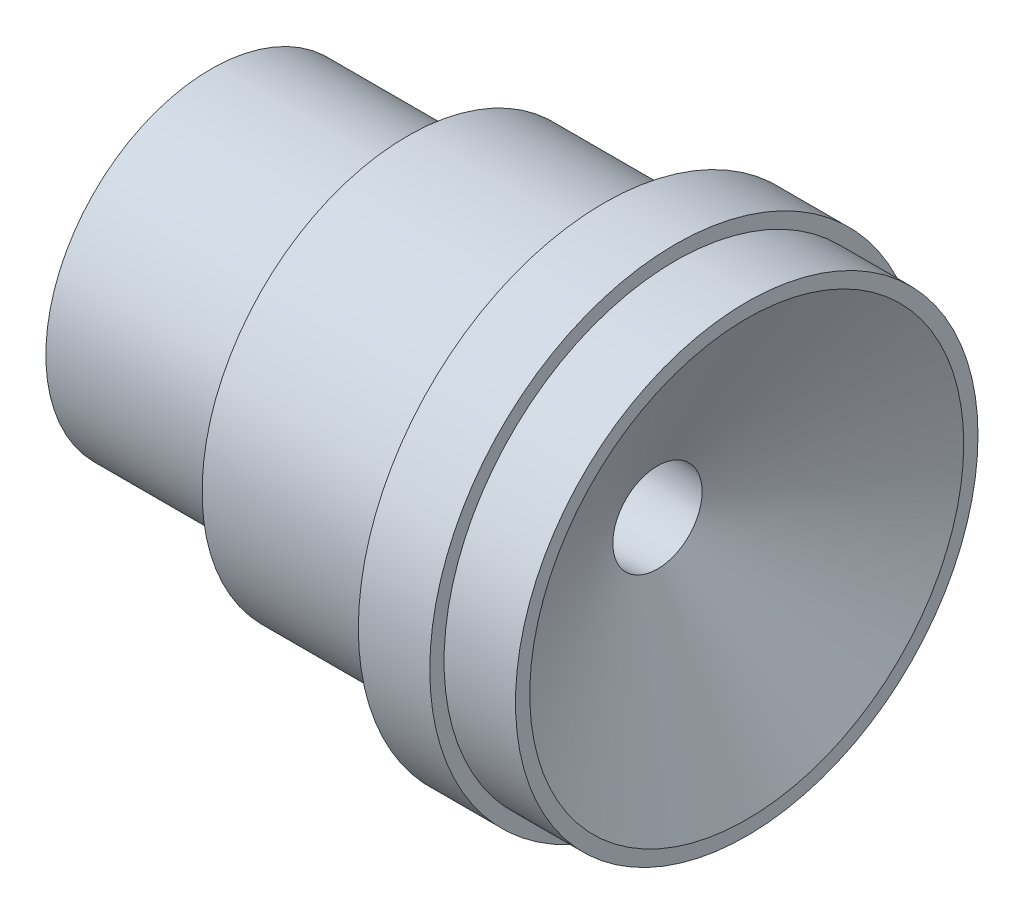
ISO-10303-21;
HEADER;
FILE_DESCRIPTION(('STEP AP214'),'2;1');
FILE_NAME('part.step','',(''),(''),'','','');
FILE_SCHEMA(('AUTOMOTIVE_DESIGN { 1 0 10303 214 1 1 1 1 }'));
ENDSEC;
DATA;
#1=APPLICATION_CONTEXT('core data for automotive mechanical design processes');
#2=APPLICATION_PROTOCOL_DEFINITION('international standard','automotive_design',2000,#1);
#3=PRODUCT_CONTEXT('',#1,'mechanical');
#4=PRODUCT('Part','Part','',(#3));
#5=PRODUCT_RELATED_PRODUCT_CATEGORY('part','',(#4));
#6=PRODUCT_DEFINITION_FORMATION('','',#4);
#7=PRODUCT_DEFINITION_CONTEXT('part definition',#1,'design');
#8=PRODUCT_DEFINITION('design','',#6,#7);
#9=PRODUCT_DEFINITION_SHAPE('','',#8);
#10=(LENGTH_UNIT() NAMED_UNIT(*) SI_UNIT(.MILLI.,.METRE.));
#11=(NAMED_UNIT(*) PLANE_ANGLE_UNIT() SI_UNIT($,.RADIAN.));
#12=(NAMED_UNIT(*) SI_UNIT($,.STERADIAN.) SOLID_ANGLE_UNIT());
#13=UNCERTAINTY_MEASURE_WITH_UNIT(LENGTH_MEASURE(1.E-05),#10,'distance_accuracy_value','');
#14=(GEOMETRIC_REPRESENTATION_CONTEXT(3) GLOBAL_UNCERTAINTY_ASSIGNED_CONTEXT((#13)) GLOBAL_UNIT_ASSIGNED_CONTEXT((#10,
#11,#12)) REPRESENTATION_CONTEXT('',''));
#15=CARTESIAN_POINT('',(0.,0.,0.));
#16=DIRECTION('',(0.,0.,1.));
#17=DIRECTION('',(1.,0.,0.));
#18=AXIS2_PLACEMENT_3D('',#15,#16,#17);
#19=CARTESIAN_POINT('',(-63.5,0.,0.));
#20=DIRECTION('',(-1.,0.,0.));
#21=DIRECTION('',(0.,0.,1.));
#22=AXIS2_PLACEMENT_3D('',#19,#20,#21);
#23=CONICAL_SURFACE('',#22,10.795,0.0698860016346425);
#24=CARTESIAN_POINT('',(0.,0.,0.));
#25=DIRECTION('',(1.,0.,0.));
#26=DIRECTION('',(0.,0.,-1.));
#27=AXIS2_PLACEMENT_3D('',#24,#25,#26);
#28=CIRCLE('',#27,6.35);
#29=CARTESIAN_POINT('',(0.,0.,-6.35));
#30=VERTEX_POINT('',#29);
#31=EDGE_CURVE('E10',#30,#30,#28,.T.);
#32=ORIENTED_EDGE('',*,*,#31,.T.);
#33=EDGE_LOOP('',(#32));
#34=FACE_BOUND('',#33,.T.);
#35=CARTESIAN_POINT('',(-63.5,0.,0.));
#36=DIRECTION('',(1.,0.,0.));
#37=DIRECTION('',(0.,0.,-1.));
#38=AXIS2_PLACEMENT_3D('',#35,#36,#37);
#39=CIRCLE('',#38,10.795);
#40=CARTESIAN_POINT('',(-63.5,0.,-10.795));
#41=VERTEX_POINT('',#40);
#42=EDGE_CURVE('E74',#41,#41,#39,.T.);
#43=ORIENTED_EDGE('',*,*,#42,.F.);
#44=EDGE_LOOP('',(#43));
#45=FACE_BOUND('',#44,.T.);
#46=ADVANCED_FACE('F37',(#34,#45),#23,.F.);
#47=CARTESIAN_POINT('',(0.,0.,0.));
#48=DIRECTION('',(1.,0.,0.));
#49=DIRECTION('',(0.,0.,-1.));
#50=AXIS2_PLACEMENT_3D('',#47,#48,#49);
#51=CONICAL_SURFACE('',#50,6.35,1.09274642149989);
#52=CARTESIAN_POINT('',(12.7,0.,0.));
#53=DIRECTION('',(1.,0.,0.));
#54=DIRECTION('',(0.,0.,-1.));
#55=AXIS2_PLACEMENT_3D('',#52,#53,#54);
#56=CIRCLE('',#55,30.861);
#57=CARTESIAN_POINT('',(12.7,0.,-30.861));
#58=VERTEX_POINT('',#57);
#59=EDGE_CURVE('E43',#58,#58,#56,.T.);
#60=CARTESIAN_POINT('',(12.7,0.,-30.861));
#61=CARTESIAN_POINT('',(12.5677083333333,0.,-30.6056770833333));
#62=CARTESIAN_POINT('',(12.4354166666667,0.,-30.3503541666667));
#63=CARTESIAN_POINT('',(12.1708333333333,0.,-29.8397083333333));
#64=CARTESIAN_POINT('',(12.0385416666667,0.,-29.5843854166667));
#65=CARTESIAN_POINT('',(11.7739583333333,0.,-29.0737395833333));
#66=CARTESIAN_POINT('',(11.6416666666667,0.,-28.8184166666667));
#67=CARTESIAN_POINT('',(11.3770833333333,0.,-28.3077708333333));
#68=CARTESIAN_POINT('',(11.2447916666667,0.,-28.0524479166667));
#69=CARTESIAN_POINT('',(10.9802083333333,0.,-27.5418020833333));
#70=CARTESIAN_POINT('',(10.8479166666667,0.,-27.2864791666667));
#71=CARTESIAN_POINT('',(10.5833333333333,0.,-26.7758333333333));
#72=CARTESIAN_POINT('',(10.4510416666667,0.,-26.5205104166667));
#73=CARTESIAN_POINT('',(10.1864583333333,0.,-26.0098645833333));
#74=CARTESIAN_POINT('',(10.0541666666667,0.,-25.7545416666667));
#75=CARTESIAN_POINT('',(9.78958333333333,0.,-25.2438958333333));
#76=CARTESIAN_POINT('',(9.65729166666666,0.,-24.9885729166667));
#77=CARTESIAN_POINT('',(9.39270833333333,0.,-24.4779270833333));
#78=CARTESIAN_POINT('',(9.26041666666666,0.,-24.2226041666667));
#79=CARTESIAN_POINT('',(8.99583333333333,0.,-23.7119583333333));
#80=CARTESIAN_POINT('',(8.86354166666666,0.,-23.4566354166667));
#81=CARTESIAN_POINT('',(8.59895833333333,0.,-22.9459895833333));
#82=CARTESIAN_POINT('',(8.46666666666666,0.,-22.6906666666667));
#83=CARTESIAN_POINT('',(8.20208333333333,0.,-22.1800208333333));
#84=CARTESIAN_POINT('',(8.06979166666666,0.,-21.9246979166667));
#85=CARTESIAN_POINT('',(7.80520833333333,0.,-21.4140520833333));
#86=CARTESIAN_POINT('',(7.67291666666666,0.,-21.1587291666667));
#87=CARTESIAN_POINT('',(7.40833333333333,0.,-20.6480833333333));
#88=CARTESIAN_POINT('',(7.27604166666666,0.,-20.3927604166667));
#89=CARTESIAN_POINT('',(7.01145833333333,0.,-19.8821145833333));
#90=CARTESIAN_POINT('',(6.87916666666666,0.,-19.6267916666667));
#91=CARTESIAN_POINT('',(6.61458333333333,0.,-19.1161458333333));
#92=CARTESIAN_POINT('',(6.48229166666666,0.,-18.8608229166667));
#93=CARTESIAN_POINT('',(6.21770833333333,0.,-18.3501770833333));
#94=CARTESIAN_POINT('',(6.08541666666667,0.,-18.0948541666667));
#95=CARTESIAN_POINT('',(5.82083333333333,0.,-17.5842083333333));
#96=CARTESIAN_POINT('',(5.68854166666667,0.,-17.3288854166667));
#97=CARTESIAN_POINT('',(5.42395833333333,0.,-16.8182395833333));
#98=CARTESIAN_POINT('',(5.29166666666667,0.,-16.5629166666667));
#99=CARTESIAN_POINT('',(5.02708333333333,0.,-16.0522708333333));
#100=CARTESIAN_POINT('',(4.89479166666667,0.,-15.7969479166667));
#101=CARTESIAN_POINT('',(4.63020833333333,0.,-15.2863020833333));
#102=CARTESIAN_POINT('',(4.49791666666667,0.,-15.0309791666667));
#103=CARTESIAN_POINT('',(4.23333333333333,0.,-14.5203333333333));
#104=CARTESIAN_POINT('',(4.10104166666667,0.,-14.2650104166667));
#105=CARTESIAN_POINT('',(3.83645833333333,0.,-13.7543645833333));
#106=CARTESIAN_POINT('',(3.70416666666667,0.,-13.4990416666667));
#107=CARTESIAN_POINT('',(3.43958333333333,0.,-12.9883958333333));
#108=CARTESIAN_POINT('',(3.30729166666667,0.,-12.7330729166667));
#109=CARTESIAN_POINT('',(3.04270833333333,0.,-12.2224270833333));
#110=CARTESIAN_POINT('',(2.91041666666667,0.,-11.9671041666667));
#111=CARTESIAN_POINT('',(2.64583333333333,0.,-11.4564583333333));
#112=CARTESIAN_POINT('',(2.51354166666667,0.,-11.2011354166667));
#113=CARTESIAN_POINT('',(2.24895833333333,0.,-10.6904895833333));
#114=CARTESIAN_POINT('',(2.11666666666667,0.,-10.4351666666667));
#115=CARTESIAN_POINT('',(1.85208333333333,0.,-9.92452083333333));
#116=CARTESIAN_POINT('',(1.71979166666667,0.,-9.66919791666666));
#117=CARTESIAN_POINT('',(1.45520833333333,0.,-9.15855208333333));
#118=CARTESIAN_POINT('',(1.32291666666667,0.,-8.90322916666667));
#119=CARTESIAN_POINT('',(1.05833333333333,0.,-8.39258333333333));
#120=CARTESIAN_POINT('',(0.926041666666666,0.,-8.13726041666667));
#121=CARTESIAN_POINT('',(0.661458333333333,0.,-7.62661458333333));
#122=CARTESIAN_POINT('',(0.529166666666666,0.,-7.37129166666667));
#123=CARTESIAN_POINT('',(0.264583333333333,0.,-6.86064583333333));
#124=CARTESIAN_POINT('',(0.132291666666667,0.,-6.60532291666667));
#125=CARTESIAN_POINT('',(0.,0.,-6.35));
#126=B_SPLINE_CURVE_WITH_KNOTS('',3,(#60,#61,#62,#63,#64,#65,#66,#67,#68,#69,#70,#71,#72,#73,
#74,#75,#76,#77,#78,#79,#80,#81,#82,#83,#84,#85,#86,#87,#88,#89,#90,#91,#92,#93,#94,#95,#96,#97,
#98,#99,#100,#101,#102,#103,#104,#105,#106,#107,#108,#109,#110,#111,#112,#113,#114,#115,#116,
#117,#118,#119,#120,#121,#122,#123,#124,#125),.UNSPECIFIED.,.F.,.F.,(4,2,2,2,2,2,2,2,2,2,2,2,2,
2,2,2,2,2,2,2,2,2,2,2,2,2,2,2,2,2,2,2,4),(0.,0.862680642880991,1.72536128576198,
2.58804192864297,3.45072257152397,4.31340321440496,5.17608385728595,6.03876450016695,
6.90144514304794,7.76412578592893,8.62680642880992,9.48948707169091,10.3521677145719,
11.2148483574529,12.0775290003339,12.9402096432149,13.8028902860959,14.6655709289769,
15.5282515718579,16.3909322147389,17.2536128576198,18.1162935005008,18.9789741433818,
19.8416547862628,20.7043354291438,21.5670160720248,22.4296967149058,23.2923773577868,
24.1550580006678,25.0177386435488,25.8804192864298,26.7430999293108,27.6057805721918),.UNSPECIFIED.);
#127=EDGE_CURVE('BSEAM82',#58,#30,#126,.T.);
#128=ORIENTED_EDGE('',*,*,#59,.T.);
#129=ORIENTED_EDGE('',*,*,#31,.F.);
#130=ORIENTED_EDGE('',*,*,#127,.T.);
#131=ORIENTED_EDGE('',*,*,#127,.F.);
#132=EDGE_LOOP('',(#128,#130,#129,#131));
#133=FACE_BOUND('',#132,.T.);
#134=ADVANCED_FACE('F82',(#133),#51,.F.);
#135=CARTESIAN_POINT('',(12.7,30.861,0.));
#136=DIRECTION('',(1.,0.,0.));
#137=DIRECTION('',(0.,0.,-1.));
#138=AXIS2_PLACEMENT_3D('',#135,#136,#137);
#139=PLANE('',#138);
#140=CARTESIAN_POINT('',(12.7,0.,0.));
#141=DIRECTION('',(1.,0.,0.));
#142=DIRECTION('',(0.,0.,-1.));
#143=AXIS2_PLACEMENT_3D('',#140,#141,#142);
#144=CIRCLE('',#143,32.893);
#145=CARTESIAN_POINT('',(12.7,0.,-32.893));
#146=VERTEX_POINT('',#145);
#147=EDGE_CURVE('E47',#146,#146,#144,.T.);
#148=ORIENTED_EDGE('',*,*,#147,.T.);
#149=EDGE_LOOP('',(#148));
#150=FACE_BOUND('',#149,.T.);
#151=ORIENTED_EDGE('',*,*,#59,.F.);
#152=EDGE_LOOP('',(#151));
#153=FACE_BOUND('',#152,.T.);
#154=ADVANCED_FACE('F86',(#150,#153),#139,.T.);
#155=CARTESIAN_POINT('',(0.,0.,0.));
#156=DIRECTION('',(1.,0.,0.));
#157=DIRECTION('',(0.,0.,-1.));
#158=AXIS2_PLACEMENT_3D('',#155,#156,#157);
#159=CYLINDRICAL_SURFACE('',#158,32.893);
#160=CARTESIAN_POINT('',(2.54,0.,0.));
#161=DIRECTION('',(1.,0.,0.));
#162=DIRECTION('',(0.,0.,-1.));
#163=AXIS2_PLACEMENT_3D('',#160,#161,#162);
#164=CIRCLE('',#163,32.893);
#165=CARTESIAN_POINT('',(2.54,0.,-32.893));
#166=VERTEX_POINT('',#165);
#167=EDGE_CURVE('E51',#166,#166,#164,.T.);
#168=ORIENTED_EDGE('',*,*,#167,.T.);
#169=EDGE_LOOP('',(#168));
#170=FACE_BOUND('',#169,.T.);
#171=ORIENTED_EDGE('',*,*,#147,.F.);
#172=EDGE_LOOP('',(#171));
#173=FACE_BOUND('',#172,.T.);
#174=ADVANCED_FACE('F90',(#170,#173),#159,.T.);
#175=CARTESIAN_POINT('',(2.54,32.893,0.));
#176=DIRECTION('',(1.,0.,0.));
#177=DIRECTION('',(0.,0.,-1.));
#178=AXIS2_PLACEMENT_3D('',#175,#176,#177);
#179=PLANE('',#178);
#180=CARTESIAN_POINT('',(2.54,0.,0.));
#181=DIRECTION('',(1.,0.,0.));
#182=DIRECTION('',(0.,0.,-1.));
#183=AXIS2_PLACEMENT_3D('',#180,#181,#182);
#184=CIRCLE('',#183,34.925);
#185=CARTESIAN_POINT('',(2.54,0.,-34.925));
#186=VERTEX_POINT('',#185);
#187=EDGE_CURVE('E56',#186,#186,#184,.T.);
#188=ORIENTED_EDGE('',*,*,#187,.T.);
#189=EDGE_LOOP('',(#188));
#190=FACE_BOUND('',#189,.T.);
#191=ORIENTED_EDGE('',*,*,#167,.F.);
#192=EDGE_LOOP('',(#191));
#193=FACE_BOUND('',#192,.T.);
#194=ADVANCED_FACE('F97',(#190,#193),#179,.T.);
#195=CARTESIAN_POINT('',(0.,0.,0.));
#196=DIRECTION('',(1.,0.,0.));
#197=DIRECTION('',(0.,0.,-1.));
#198=AXIS2_PLACEMENT_3D('',#195,#196,#197);
#199=CYLINDRICAL_SURFACE('',#198,34.925);
#200=CARTESIAN_POINT('',(-7.62000000000001,0.,0.));
#201=DIRECTION('',(1.,0.,0.));
#202=DIRECTION('',(0.,0.,-1.));
#203=AXIS2_PLACEMENT_3D('',#200,#201,#202);
#204=CIRCLE('',#203,34.925);
#205=CARTESIAN_POINT('',(-7.62000000000001,0.,-34.925));
#206=VERTEX_POINT('',#205);
#207=EDGE_CURVE('E59',#206,#206,#204,.T.);
#208=ORIENTED_EDGE('',*,*,#207,.T.);
#209=EDGE_LOOP('',(#208));
#210=FACE_BOUND('',#209,.T.);
#211=ORIENTED_EDGE('',*,*,#187,.F.);
#212=EDGE_LOOP('',(#211));
#213=FACE_BOUND('',#212,.T.);
#214=ADVANCED_FACE('F101',(#210,#213),#199,.T.);
#215=CARTESIAN_POINT('',(-7.62000000000001,34.925,0.));
#216=DIRECTION('',(-1.,0.,0.));
#217=DIRECTION('',(0.,0.,1.));
#218=AXIS2_PLACEMENT_3D('',#215,#216,#217);
#219=PLANE('',#218);
#220=CARTESIAN_POINT('',(-7.62000000000001,0.,0.));
#221=DIRECTION('',(1.,0.,0.));
#222=DIRECTION('',(0.,0.,-1.));
#223=AXIS2_PLACEMENT_3D('',#220,#221,#222);
#224=CIRCLE('',#223,29.21);
#225=CARTESIAN_POINT('',(-7.62000000000001,0.,-29.21));
#226=VERTEX_POINT('',#225);
#227=EDGE_CURVE('E62',#226,#226,#224,.T.);
#228=ORIENTED_EDGE('',*,*,#227,.T.);
#229=EDGE_LOOP('',(#228));
#230=FACE_BOUND('',#229,.T.);
#231=ORIENTED_EDGE('',*,*,#207,.F.);
#232=EDGE_LOOP('',(#231));
#233=FACE_BOUND('',#232,.T.);
#234=ADVANCED_FACE('F105',(#230,#233),#219,.T.);
#235=CARTESIAN_POINT('',(0.,0.,0.));
#236=DIRECTION('',(1.,0.,0.));
#237=DIRECTION('',(0.,0.,-1.));
#238=AXIS2_PLACEMENT_3D('',#235,#236,#237);
#239=CYLINDRICAL_SURFACE('',#238,29.21);
#240=CARTESIAN_POINT('',(-35.56,0.,0.));
#241=DIRECTION('',(1.,0.,0.));
#242=DIRECTION('',(0.,0.,-1.));
#243=AXIS2_PLACEMENT_3D('',#240,#241,#242);
#244=CIRCLE('',#243,29.21);
#245=CARTESIAN_POINT('',(-35.56,0.,-29.21));
#246=VERTEX_POINT('',#245);
#247=EDGE_CURVE('E65',#246,#246,#244,.T.);
#248=ORIENTED_EDGE('',*,*,#247,.T.);
#249=EDGE_LOOP('',(#248));
#250=FACE_BOUND('',#249,.T.);
#251=ORIENTED_EDGE('',*,*,#227,.F.);
#252=EDGE_LOOP('',(#251));
#253=FACE_BOUND('',#252,.T.);
#254=ADVANCED_FACE('F109',(#250,#253),#239,.T.);
#255=CARTESIAN_POINT('',(-35.56,29.21,0.));
#256=DIRECTION('',(-1.,0.,0.));
#257=DIRECTION('',(0.,0.,1.));
#258=AXIS2_PLACEMENT_3D('',#255,#256,#257);
#259=PLANE('',#258);
#260=CARTESIAN_POINT('',(-35.56,0.,0.));
#261=DIRECTION('',(1.,0.,0.));
#262=DIRECTION('',(0.,0.,-1.));
#263=AXIS2_PLACEMENT_3D('',#260,#261,#262);
#264=CIRCLE('',#263,23.495);
#265=CARTESIAN_POINT('',(-35.56,0.,-23.495));
#266=VERTEX_POINT('',#265);
#267=EDGE_CURVE('E68',#266,#266,#264,.T.);
#268=ORIENTED_EDGE('',*,*,#267,.T.);
#269=EDGE_LOOP('',(#268));
#270=FACE_BOUND('',#269,.T.);
#271=ORIENTED_EDGE('',*,*,#247,.F.);
#272=EDGE_LOOP('',(#271));
#273=FACE_BOUND('',#272,.T.);
#274=ADVANCED_FACE('F113',(#270,#273),#259,.T.);
#275=CARTESIAN_POINT('',(0.,0.,0.));
#276=DIRECTION('',(1.,0.,0.));
#277=DIRECTION('',(0.,0.,-1.));
#278=AXIS2_PLACEMENT_3D('',#275,#276,#277);
#279=CYLINDRICAL_SURFACE('',#278,23.495);
#280=CARTESIAN_POINT('',(-63.5,0.,0.));
#281=DIRECTION('',(1.,0.,0.));
#282=DIRECTION('',(0.,0.,-1.));
#283=AXIS2_PLACEMENT_3D('',#280,#281,#282);
#284=CIRCLE('',#283,23.495);
#285=CARTESIAN_POINT('',(-63.5,0.,-23.495));
#286=VERTEX_POINT('',#285);
#287=EDGE_CURVE('E71',#286,#286,#284,.T.);
#288=ORIENTED_EDGE('',*,*,#287,.T.);
#289=EDGE_LOOP('',(#288));
#290=FACE_BOUND('',#289,.T.);
#291=ORIENTED_EDGE('',*,*,#267,.F.);
#292=EDGE_LOOP('',(#291));
#293=FACE_BOUND('',#292,.T.);
#294=ADVANCED_FACE('F117',(#290,#293),#279,.T.);
#295=CARTESIAN_POINT('',(-63.5,23.495,0.));
#296=DIRECTION('',(-1.,0.,0.));
#297=DIRECTION('',(0.,0.,1.));
#298=AXIS2_PLACEMENT_3D('',#295,#296,#297);
#299=PLANE('',#298);
#300=ORIENTED_EDGE('',*,*,#42,.T.);
#301=EDGE_LOOP('',(#300));
#302=FACE_BOUND('',#301,.T.);
#303=ORIENTED_EDGE('',*,*,#287,.F.);
#304=EDGE_LOOP('',(#303));
#305=FACE_BOUND('',#304,.T.);
#306=ADVANCED_FACE('F78',(#302,#305),#299,.T.);
#307=CLOSED_SHELL('',(#46,#134,#154,#174,#194,#214,#234,#254,#274,#294,#306));
#308=MANIFOLD_SOLID_BREP('B2',#307);
#309=ADVANCED_BREP_SHAPE_REPRESENTATION('',(#18,#308),#14);
#310=SHAPE_DEFINITION_REPRESENTATION(#9,#309);
ENDSEC;
END-ISO-10303-21;
